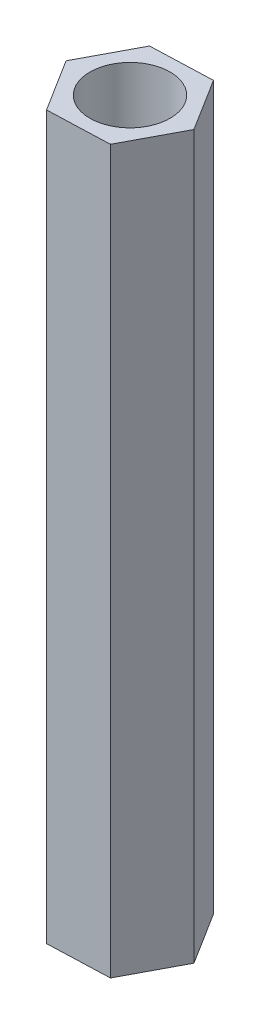
ISO-10303-21;
HEADER;
FILE_DESCRIPTION(('STEP AP214'),'2;1');
FILE_NAME('part.step','',(''),(''),'','','');
FILE_SCHEMA(('AUTOMOTIVE_DESIGN { 1 0 10303 214 1 1 1 1 }'));
ENDSEC;
DATA;
#1=APPLICATION_CONTEXT('core data for automotive mechanical design processes');
#2=APPLICATION_PROTOCOL_DEFINITION('international standard','automotive_design',2000,#1);
#3=PRODUCT_CONTEXT('',#1,'mechanical');
#4=PRODUCT('Part','Part','',(#3));
#5=PRODUCT_RELATED_PRODUCT_CATEGORY('part','',(#4));
#6=PRODUCT_DEFINITION_FORMATION('','',#4);
#7=PRODUCT_DEFINITION_CONTEXT('part definition',#1,'design');
#8=PRODUCT_DEFINITION('design','',#6,#7);
#9=PRODUCT_DEFINITION_SHAPE('','',#8);
#10=(LENGTH_UNIT() NAMED_UNIT(*) SI_UNIT(.MILLI.,.METRE.));
#11=(NAMED_UNIT(*) PLANE_ANGLE_UNIT() SI_UNIT($,.RADIAN.));
#12=(NAMED_UNIT(*) SI_UNIT($,.STERADIAN.) SOLID_ANGLE_UNIT());
#13=UNCERTAINTY_MEASURE_WITH_UNIT(LENGTH_MEASURE(1.E-05),#10,'distance_accuracy_value','');
#14=(GEOMETRIC_REPRESENTATION_CONTEXT(3) GLOBAL_UNCERTAINTY_ASSIGNED_CONTEXT((#13)) GLOBAL_UNIT_ASSIGNED_CONTEXT((#10,
#11,#12)) REPRESENTATION_CONTEXT('',''));
#15=CARTESIAN_POINT('',(0.,0.,0.));
#16=DIRECTION('',(0.,0.,1.));
#17=DIRECTION('',(1.,0.,0.));
#18=AXIS2_PLACEMENT_3D('',#15,#16,#17);
#19=CARTESIAN_POINT('',(0.,27.,0.));
#20=DIRECTION('',(0.,1.,0.));
#21=DIRECTION('',(0.,0.,1.));
#22=AXIS2_PLACEMENT_3D('',#19,#20,#21);
#23=PLANE('',#22);
#24=DIRECTION('',(-0.530895923230705,0.,-0.847437029340244));
#25=VECTOR('',#24,1.);
#26=CARTESIAN_POINT('',(2.30789986705833,27.,-0.0832558524397174));
#27=LINE('',#26,#25);
#28=CARTESIAN_POINT('',(2.30789986705833,27.,-0.0832558524397174));
#29=VERTEX_POINT('',#28);
#30=CARTESIAN_POINT('',(1.08184825030264,27.,-2.0403278404831));
#31=VERTEX_POINT('',#30);
#32=EDGE_CURVE('E131',#29,#31,#27,.T.);
#33=ORIENTED_EDGE('',*,*,#32,.T.);
#34=DIRECTION('',(-0.999349957131622,0.,0.0360508416132619));
#35=VECTOR('',#34,1.);
#36=CARTESIAN_POINT('',(1.08184825030264,27.,-2.0403278404831));
#37=LINE('',#36,#35);
#38=CARTESIAN_POINT('',(-1.22605161675569,27.,-1.95707198804339));
#39=VERTEX_POINT('',#38);
#40=EDGE_CURVE('E89',#31,#39,#37,.T.);
#41=ORIENTED_EDGE('',*,*,#40,.T.);
#42=DIRECTION('',(-0.468454033900917,0.,0.883487870953506));
#43=VECTOR('',#42,1.);
#44=CARTESIAN_POINT('',(-1.22605161675569,27.,-1.95707198804339));
#45=LINE('',#44,#43);
#46=CARTESIAN_POINT('',(-2.30789986705833,27.,0.083255852439718));
#47=VERTEX_POINT('',#46);
#48=EDGE_CURVE('E102',#39,#47,#45,.T.);
#49=ORIENTED_EDGE('',*,*,#48,.T.);
#50=DIRECTION('',(0.530895923230705,0.,0.847437029340244));
#51=VECTOR('',#50,1.);
#52=CARTESIAN_POINT('',(-2.30789986705833,27.,0.083255852439718));
#53=LINE('',#52,#51);
#54=CARTESIAN_POINT('',(-1.08184825030264,27.,2.0403278404831));
#55=VERTEX_POINT('',#54);
#56=EDGE_CURVE('E96',#47,#55,#53,.T.);
#57=ORIENTED_EDGE('',*,*,#56,.T.);
#58=DIRECTION('',(0.999349957131622,0.,-0.0360508416132621));
#59=VECTOR('',#58,1.);
#60=CARTESIAN_POINT('',(-1.08184825030264,27.,2.0403278404831));
#61=LINE('',#60,#59);
#62=CARTESIAN_POINT('',(1.22605161675569,27.,1.95707198804339));
#63=VERTEX_POINT('',#62);
#64=EDGE_CURVE('E100',#55,#63,#61,.T.);
#65=ORIENTED_EDGE('',*,*,#64,.T.);
#66=DIRECTION('',(0.468454033900917,0.,-0.883487870953506));
#67=VECTOR('',#66,1.);
#68=CARTESIAN_POINT('',(1.22605161675569,27.,1.95707198804339));
#69=LINE('',#68,#67);
#70=EDGE_CURVE('E52',#63,#29,#69,.T.);
#71=ORIENTED_EDGE('',*,*,#70,.T.);
#72=EDGE_LOOP('',(#33,#41,#49,#57,#65,#71));
#73=FACE_BOUND('',#72,.T.);
#74=CARTESIAN_POINT('',(0.,27.,0.));
#75=DIRECTION('',(0.,1.,0.));
#76=DIRECTION('',(0.,0.,1.));
#77=AXIS2_PLACEMENT_3D('',#74,#75,#76);
#78=CIRCLE('',#77,1.5);
#79=CARTESIAN_POINT('',(0.,27.,1.5));
#80=VERTEX_POINT('',#79);
#81=EDGE_CURVE('E124',#80,#80,#78,.T.);
#82=ORIENTED_EDGE('',*,*,#81,.F.);
#83=EDGE_LOOP('',(#82));
#84=FACE_BOUND('',#83,.T.);
#85=ADVANCED_FACE('F35',(#73,#84),#23,.T.);
#86=CARTESIAN_POINT('',(0.,0.,0.));
#87=DIRECTION('',(0.,1.,0.));
#88=DIRECTION('',(0.,0.,1.));
#89=AXIS2_PLACEMENT_3D('',#86,#87,#88);
#90=PLANE('',#89);
#91=DIRECTION('',(-0.530895923230705,0.,-0.847437029340244));
#92=VECTOR('',#91,1.);
#93=CARTESIAN_POINT('',(2.30789986705833,0.,-0.0832558524397174));
#94=LINE('',#93,#92);
#95=CARTESIAN_POINT('',(2.30789986705833,0.,-0.0832558524397174));
#96=VERTEX_POINT('',#95);
#97=CARTESIAN_POINT('',(1.08184825030264,0.,-2.0403278404831));
#98=VERTEX_POINT('',#97);
#99=EDGE_CURVE('E120',#96,#98,#94,.T.);
#100=ORIENTED_EDGE('',*,*,#99,.F.);
#101=DIRECTION('',(0.468454033900917,0.,-0.883487870953506));
#102=VECTOR('',#101,1.);
#103=CARTESIAN_POINT('',(1.22605161675569,0.,1.95707198804339));
#104=LINE('',#103,#102);
#105=CARTESIAN_POINT('',(1.22605161675569,0.,1.95707198804339));
#106=VERTEX_POINT('',#105);
#107=EDGE_CURVE('E81',#106,#96,#104,.T.);
#108=ORIENTED_EDGE('',*,*,#107,.F.);
#109=DIRECTION('',(0.999349957131622,0.,-0.0360508416132621));
#110=VECTOR('',#109,1.);
#111=CARTESIAN_POINT('',(-1.08184825030264,0.,2.0403278404831));
#112=LINE('',#111,#110);
#113=CARTESIAN_POINT('',(-1.08184825030264,0.,2.0403278404831));
#114=VERTEX_POINT('',#113);
#115=EDGE_CURVE('E75',#114,#106,#112,.T.);
#116=ORIENTED_EDGE('',*,*,#115,.F.);
#117=DIRECTION('',(0.530895923230705,0.,0.847437029340244));
#118=VECTOR('',#117,1.);
#119=CARTESIAN_POINT('',(-2.30789986705833,0.,0.083255852439718));
#120=LINE('',#119,#118);
#121=CARTESIAN_POINT('',(-2.30789986705833,0.,0.083255852439718));
#122=VERTEX_POINT('',#121);
#123=EDGE_CURVE('E110',#122,#114,#120,.T.);
#124=ORIENTED_EDGE('',*,*,#123,.F.);
#125=DIRECTION('',(-0.468454033900917,0.,0.883487870953506));
#126=VECTOR('',#125,1.);
#127=CARTESIAN_POINT('',(-1.22605161675569,0.,-1.95707198804339));
#128=LINE('',#127,#126);
#129=CARTESIAN_POINT('',(-1.22605161675569,0.,-1.95707198804339));
#130=VERTEX_POINT('',#129);
#131=EDGE_CURVE('E126',#130,#122,#128,.T.);
#132=ORIENTED_EDGE('',*,*,#131,.F.);
#133=DIRECTION('',(-0.999349957131622,0.,0.0360508416132619));
#134=VECTOR('',#133,1.);
#135=CARTESIAN_POINT('',(1.08184825030264,0.,-2.0403278404831));
#136=LINE('',#135,#134);
#137=EDGE_CURVE('E123',#98,#130,#136,.T.);
#138=ORIENTED_EDGE('',*,*,#137,.F.);
#139=EDGE_LOOP('',(#100,#108,#116,#124,#132,#138));
#140=FACE_BOUND('',#139,.T.);
#141=CARTESIAN_POINT('',(0.,0.,0.));
#142=DIRECTION('',(0.,1.,0.));
#143=DIRECTION('',(0.,0.,1.));
#144=AXIS2_PLACEMENT_3D('',#141,#142,#143);
#145=CIRCLE('',#144,1.5);
#146=CARTESIAN_POINT('',(0.,0.,1.5));
#147=VERTEX_POINT('',#146);
#148=EDGE_CURVE('E224',#147,#147,#145,.T.);
#149=ORIENTED_EDGE('',*,*,#148,.T.);
#150=EDGE_LOOP('',(#149));
#151=FACE_BOUND('',#150,.T.);
#152=ADVANCED_FACE('F140',(#140,#151),#90,.F.);
#153=CARTESIAN_POINT('',(2.30789986705833,27.,-0.0832558524397174));
#154=DIRECTION('',(-0.847437029340244,0.,0.530895923230705));
#155=DIRECTION('',(0.530895923230705,0.,0.847437029340244));
#156=AXIS2_PLACEMENT_3D('',#153,#154,#155);
#157=PLANE('',#156);
#158=ORIENTED_EDGE('',*,*,#99,.T.);
#159=DIRECTION('',(0.,-1.,0.));
#160=VECTOR('',#159,1.);
#161=CARTESIAN_POINT('',(1.08184825030264,27.,-2.0403278404831));
#162=LINE('',#161,#160);
#163=EDGE_CURVE('E11',#31,#98,#162,.T.);
#164=ORIENTED_EDGE('',*,*,#163,.F.);
#165=ORIENTED_EDGE('',*,*,#32,.F.);
#166=DIRECTION('',(0.,-1.,0.));
#167=VECTOR('',#166,1.);
#168=CARTESIAN_POINT('',(2.30789986705833,27.,-0.0832558524397174));
#169=LINE('',#168,#167);
#170=EDGE_CURVE('E116',#29,#96,#169,.T.);
#171=ORIENTED_EDGE('',*,*,#170,.T.);
#172=EDGE_LOOP('',(#158,#164,#165,#171));
#173=FACE_BOUND('',#172,.T.);
#174=ADVANCED_FACE('F37',(#173),#157,.F.);
#175=CARTESIAN_POINT('',(1.08184825030264,27.,-2.0403278404831));
#176=DIRECTION('',(0.0360508416132619,0.,0.999349957131622));
#177=DIRECTION('',(0.999349957131623,0.,-0.0360508416132619));
#178=AXIS2_PLACEMENT_3D('',#175,#176,#177);
#179=PLANE('',#178);
#180=ORIENTED_EDGE('',*,*,#137,.T.);
#181=DIRECTION('',(0.,-1.,0.));
#182=VECTOR('',#181,1.);
#183=CARTESIAN_POINT('',(-1.22605161675569,27.,-1.95707198804339));
#184=LINE('',#183,#182);
#185=EDGE_CURVE('E44',#39,#130,#184,.T.);
#186=ORIENTED_EDGE('',*,*,#185,.F.);
#187=ORIENTED_EDGE('',*,*,#40,.F.);
#188=ORIENTED_EDGE('',*,*,#163,.T.);
#189=EDGE_LOOP('',(#180,#186,#187,#188));
#190=FACE_BOUND('',#189,.T.);
#191=ADVANCED_FACE('F165',(#190),#179,.F.);
#192=CARTESIAN_POINT('',(-1.22605161675569,27.,-1.95707198804339));
#193=DIRECTION('',(0.883487870953506,0.,0.468454033900917));
#194=DIRECTION('',(0.468454033900917,0.,-0.883487870953506));
#195=AXIS2_PLACEMENT_3D('',#192,#193,#194);
#196=PLANE('',#195);
#197=ORIENTED_EDGE('',*,*,#131,.T.);
#198=DIRECTION('',(0.,-1.,0.));
#199=VECTOR('',#198,1.);
#200=CARTESIAN_POINT('',(-2.30789986705833,27.,0.083255852439718));
#201=LINE('',#200,#199);
#202=EDGE_CURVE('E111',#47,#122,#201,.T.);
#203=ORIENTED_EDGE('',*,*,#202,.F.);
#204=ORIENTED_EDGE('',*,*,#48,.F.);
#205=ORIENTED_EDGE('',*,*,#185,.T.);
#206=EDGE_LOOP('',(#197,#203,#204,#205));
#207=FACE_BOUND('',#206,.T.);
#208=ADVANCED_FACE('F137',(#207),#196,.F.);
#209=CARTESIAN_POINT('',(-2.30789986705833,27.,0.083255852439718));
#210=DIRECTION('',(0.847437029340244,0.,-0.530895923230705));
#211=DIRECTION('',(-0.530895923230706,0.,-0.847437029340244));
#212=AXIS2_PLACEMENT_3D('',#209,#210,#211);
#213=PLANE('',#212);
#214=ORIENTED_EDGE('',*,*,#123,.T.);
#215=DIRECTION('',(0.,-1.,0.));
#216=VECTOR('',#215,1.);
#217=CARTESIAN_POINT('',(-1.08184825030264,27.,2.0403278404831));
#218=LINE('',#217,#216);
#219=EDGE_CURVE('E107',#55,#114,#218,.T.);
#220=ORIENTED_EDGE('',*,*,#219,.F.);
#221=ORIENTED_EDGE('',*,*,#56,.F.);
#222=ORIENTED_EDGE('',*,*,#202,.T.);
#223=EDGE_LOOP('',(#214,#220,#221,#222));
#224=FACE_BOUND('',#223,.T.);
#225=ADVANCED_FACE('F108',(#224),#213,.F.);
#226=CARTESIAN_POINT('',(-1.08184825030264,27.,2.0403278404831));
#227=DIRECTION('',(-0.0360508416132621,0.,-0.999349957131622));
#228=DIRECTION('',(-0.999349957131623,0.,0.0360508416132621));
#229=AXIS2_PLACEMENT_3D('',#226,#227,#228);
#230=PLANE('',#229);
#231=ORIENTED_EDGE('',*,*,#115,.T.);
#232=DIRECTION('',(0.,-1.,0.));
#233=VECTOR('',#232,1.);
#234=CARTESIAN_POINT('',(1.22605161675569,27.,1.95707198804339));
#235=LINE('',#234,#233);
#236=EDGE_CURVE('E112',#63,#106,#235,.T.);
#237=ORIENTED_EDGE('',*,*,#236,.F.);
#238=ORIENTED_EDGE('',*,*,#64,.F.);
#239=ORIENTED_EDGE('',*,*,#219,.T.);
#240=EDGE_LOOP('',(#231,#237,#238,#239));
#241=FACE_BOUND('',#240,.T.);
#242=ADVANCED_FACE('F114',(#241),#230,.F.);
#243=CARTESIAN_POINT('',(1.22605161675569,27.,1.95707198804339));
#244=DIRECTION('',(-0.883487870953506,0.,-0.468454033900917));
#245=DIRECTION('',(-0.468454033900917,0.,0.883487870953506));
#246=AXIS2_PLACEMENT_3D('',#243,#244,#245);
#247=PLANE('',#246);
#248=ORIENTED_EDGE('',*,*,#107,.T.);
#249=ORIENTED_EDGE('',*,*,#170,.F.);
#250=ORIENTED_EDGE('',*,*,#70,.F.);
#251=ORIENTED_EDGE('',*,*,#236,.T.);
#252=EDGE_LOOP('',(#248,#249,#250,#251));
#253=FACE_BOUND('',#252,.T.);
#254=ADVANCED_FACE('F145',(#253),#247,.F.);
#255=CARTESIAN_POINT('',(0.,27.,0.));
#256=DIRECTION('',(0.,-1.,0.));
#257=DIRECTION('',(0.,0.,-1.));
#258=AXIS2_PLACEMENT_3D('',#255,#256,#257);
#259=CYLINDRICAL_SURFACE('',#258,1.5);
#260=ORIENTED_EDGE('',*,*,#81,.T.);
#261=EDGE_LOOP('',(#260));
#262=FACE_BOUND('',#261,.T.);
#263=ORIENTED_EDGE('',*,*,#148,.F.);
#264=EDGE_LOOP('',(#263));
#265=FACE_BOUND('',#264,.T.);
#266=ADVANCED_FACE('F147',(#262,#265),#259,.F.);
#267=CLOSED_SHELL('',(#85,#152,#174,#191,#208,#225,#242,#254,#266));
#268=MANIFOLD_SOLID_BREP('B2',#267);
#269=ADVANCED_BREP_SHAPE_REPRESENTATION('',(#18,#268),#14);
#270=SHAPE_DEFINITION_REPRESENTATION(#9,#269);
ENDSEC;
END-ISO-10303-21;
